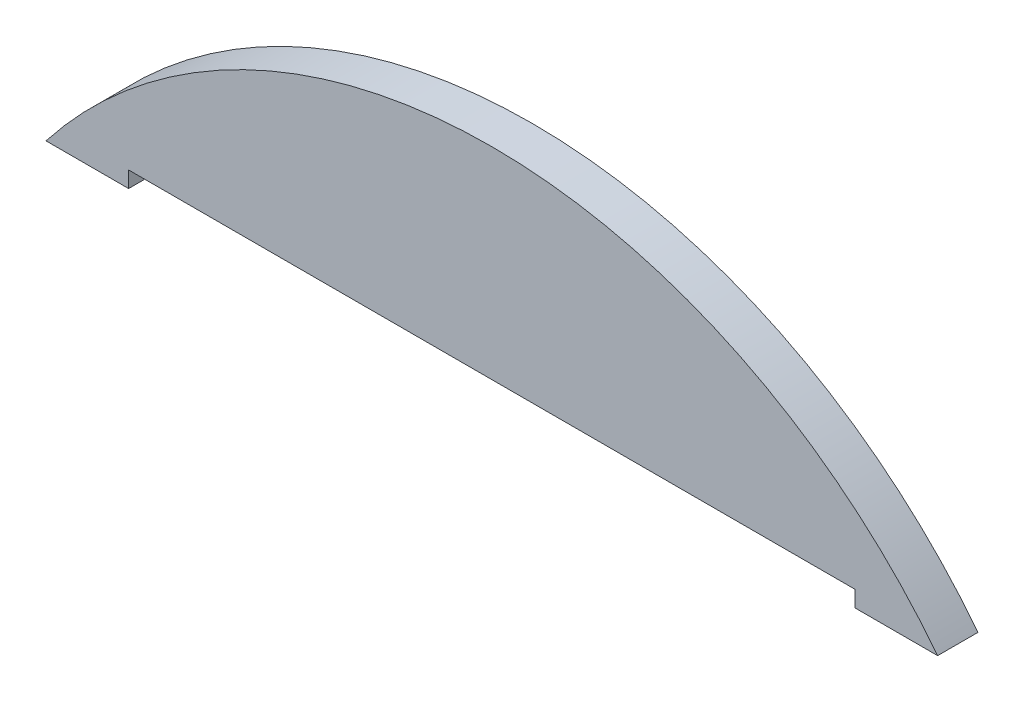
ISO-10303-21;
HEADER;
FILE_DESCRIPTION(('STEP AP214'),'2;1');
FILE_NAME('part.step','',(''),(''),'','','');
FILE_SCHEMA(('AUTOMOTIVE_DESIGN { 1 0 10303 214 1 1 1 1 }'));
ENDSEC;
DATA;
#1=APPLICATION_CONTEXT('core data for automotive mechanical design processes');
#2=APPLICATION_PROTOCOL_DEFINITION('international standard','automotive_design',2000,#1);
#3=PRODUCT_CONTEXT('',#1,'mechanical');
#4=PRODUCT('Part','Part','',(#3));
#5=PRODUCT_RELATED_PRODUCT_CATEGORY('part','',(#4));
#6=PRODUCT_DEFINITION_FORMATION('','',#4);
#7=PRODUCT_DEFINITION_CONTEXT('part definition',#1,'design');
#8=PRODUCT_DEFINITION('design','',#6,#7);
#9=PRODUCT_DEFINITION_SHAPE('','',#8);
#10=(LENGTH_UNIT() NAMED_UNIT(*) SI_UNIT(.MILLI.,.METRE.));
#11=(NAMED_UNIT(*) PLANE_ANGLE_UNIT() SI_UNIT($,.RADIAN.));
#12=(NAMED_UNIT(*) SI_UNIT($,.STERADIAN.) SOLID_ANGLE_UNIT());
#13=UNCERTAINTY_MEASURE_WITH_UNIT(LENGTH_MEASURE(1.E-05),#10,'distance_accuracy_value','');
#14=(GEOMETRIC_REPRESENTATION_CONTEXT(3) GLOBAL_UNCERTAINTY_ASSIGNED_CONTEXT((#13)) GLOBAL_UNIT_ASSIGNED_CONTEXT((#10,
#11,#12)) REPRESENTATION_CONTEXT('',''));
#15=CARTESIAN_POINT('',(0.,0.,0.));
#16=DIRECTION('',(0.,0.,1.));
#17=DIRECTION('',(1.,0.,0.));
#18=AXIS2_PLACEMENT_3D('',#15,#16,#17);
#19=CARTESIAN_POINT('',(0.,0.,5.));
#20=DIRECTION('',(0.,0.,1.));
#21=DIRECTION('',(1.,0.,0.));
#22=AXIS2_PLACEMENT_3D('',#19,#20,#21);
#23=PLANE('',#22);
#24=CARTESIAN_POINT('',(0.,0.,5.));
#25=DIRECTION('',(0.,0.,1.));
#26=DIRECTION('',(-1.,0.,0.));
#27=AXIS2_PLACEMENT_3D('',#24,#25,#26);
#28=CIRCLE('',#27,70.);
#29=CARTESIAN_POINT('',(55.2358579185659,43.,5.));
#30=VERTEX_POINT('',#29);
#31=CARTESIAN_POINT('',(-55.2358579185659,43.,5.));
#32=VERTEX_POINT('',#31);
#33=EDGE_CURVE('E93',#30,#32,#28,.T.);
#34=ORIENTED_EDGE('',*,*,#33,.T.);
#35=DIRECTION('',(1.,0.,0.));
#36=VECTOR('',#35,1.);
#37=CARTESIAN_POINT('',(-55.2358579185659,43.,5.));
#38=LINE('',#37,#36);
#39=CARTESIAN_POINT('',(-45.,43.,5.));
#40=VERTEX_POINT('',#39);
#41=EDGE_CURVE('E103',#32,#40,#38,.T.);
#42=ORIENTED_EDGE('',*,*,#41,.T.);
#43=DIRECTION('',(0.,-1.,0.));
#44=VECTOR('',#43,1.);
#45=CARTESIAN_POINT('',(-45.,-45.,5.));
#46=LINE('',#45,#44);
#47=CARTESIAN_POINT('',(-45.,45.,5.));
#48=VERTEX_POINT('',#47);
#49=EDGE_CURVE('E114',#48,#40,#46,.T.);
#50=ORIENTED_EDGE('',*,*,#49,.F.);
#51=DIRECTION('',(-1.,0.,0.));
#52=VECTOR('',#51,1.);
#53=CARTESIAN_POINT('',(-45.,45.,5.));
#54=LINE('',#53,#52);
#55=CARTESIAN_POINT('',(45.,45.,5.));
#56=VERTEX_POINT('',#55);
#57=EDGE_CURVE('E112',#56,#48,#54,.T.);
#58=ORIENTED_EDGE('',*,*,#57,.F.);
#59=DIRECTION('',(0.,1.,0.));
#60=VECTOR('',#59,1.);
#61=CARTESIAN_POINT('',(45.,45.,5.));
#62=LINE('',#61,#60);
#63=CARTESIAN_POINT('',(45.,43.,5.));
#64=VERTEX_POINT('',#63);
#65=EDGE_CURVE('E102',#64,#56,#62,.T.);
#66=ORIENTED_EDGE('',*,*,#65,.F.);
#67=EDGE_CURVE('E47',#64,#30,#38,.T.);
#68=ORIENTED_EDGE('',*,*,#67,.T.);
#69=EDGE_LOOP('',(#34,#42,#50,#58,#66,#68));
#70=FACE_BOUND('',#69,.T.);
#71=ADVANCED_FACE('F32',(#70),#23,.T.);
#72=CARTESIAN_POINT('',(0.,0.,0.));
#73=DIRECTION('',(0.,0.,1.));
#74=DIRECTION('',(1.,0.,0.));
#75=AXIS2_PLACEMENT_3D('',#72,#73,#74);
#76=PLANE('',#75);
#77=DIRECTION('',(1.,0.,0.));
#78=VECTOR('',#77,1.);
#79=CARTESIAN_POINT('',(0.,43.,0.));
#80=LINE('',#79,#78);
#81=CARTESIAN_POINT('',(-55.2358579185659,43.,0.));
#82=VERTEX_POINT('',#81);
#83=CARTESIAN_POINT('',(-45.,43.,0.));
#84=VERTEX_POINT('',#83);
#85=EDGE_CURVE('E109',#82,#84,#80,.T.);
#86=ORIENTED_EDGE('',*,*,#85,.F.);
#87=CARTESIAN_POINT('',(0.,0.,0.));
#88=DIRECTION('',(0.,0.,1.));
#89=DIRECTION('',(1.,0.,0.));
#90=AXIS2_PLACEMENT_3D('',#87,#88,#89);
#91=CIRCLE('',#90,70.);
#92=CARTESIAN_POINT('',(55.2358579185659,43.,0.));
#93=VERTEX_POINT('',#92);
#94=EDGE_CURVE('E11',#93,#82,#91,.T.);
#95=ORIENTED_EDGE('',*,*,#94,.F.);
#96=CARTESIAN_POINT('',(45.,43.,0.));
#97=VERTEX_POINT('',#96);
#98=EDGE_CURVE('E87',#97,#93,#80,.T.);
#99=ORIENTED_EDGE('',*,*,#98,.F.);
#100=DIRECTION('',(0.,1.,0.));
#101=VECTOR('',#100,1.);
#102=CARTESIAN_POINT('',(45.,45.,0.));
#103=LINE('',#102,#101);
#104=CARTESIAN_POINT('',(45.,45.,0.));
#105=VERTEX_POINT('',#104);
#106=EDGE_CURVE('E55',#97,#105,#103,.T.);
#107=ORIENTED_EDGE('',*,*,#106,.T.);
#108=DIRECTION('',(-1.,0.,0.));
#109=VECTOR('',#108,1.);
#110=CARTESIAN_POINT('',(-45.,45.,0.));
#111=LINE('',#110,#109);
#112=CARTESIAN_POINT('',(-45.,45.,0.));
#113=VERTEX_POINT('',#112);
#114=EDGE_CURVE('E119',#105,#113,#111,.T.);
#115=ORIENTED_EDGE('',*,*,#114,.T.);
#116=DIRECTION('',(0.,-1.,0.));
#117=VECTOR('',#116,1.);
#118=CARTESIAN_POINT('',(-45.,-45.,0.));
#119=LINE('',#118,#117);
#120=EDGE_CURVE('E121',#113,#84,#119,.T.);
#121=ORIENTED_EDGE('',*,*,#120,.T.);
#122=EDGE_LOOP('',(#86,#95,#99,#107,#115,#121));
#123=FACE_BOUND('',#122,.T.);
#124=ADVANCED_FACE('F34',(#123),#76,.F.);
#125=CARTESIAN_POINT('',(-45.,-45.,5.));
#126=DIRECTION('',(1.,0.,0.));
#127=DIRECTION('',(0.,1.,0.));
#128=AXIS2_PLACEMENT_3D('',#125,#126,#127);
#129=PLANE('',#128);
#130=ORIENTED_EDGE('',*,*,#49,.T.);
#131=DIRECTION('',(0.,0.,-1.));
#132=VECTOR('',#131,1.);
#133=CARTESIAN_POINT('',(-45.,43.,5.));
#134=LINE('',#133,#132);
#135=EDGE_CURVE('E108',#40,#84,#134,.T.);
#136=ORIENTED_EDGE('',*,*,#135,.T.);
#137=ORIENTED_EDGE('',*,*,#120,.F.);
#138=DIRECTION('',(0.,0.,-1.));
#139=VECTOR('',#138,1.);
#140=CARTESIAN_POINT('',(-45.,45.,5.));
#141=LINE('',#140,#139);
#142=EDGE_CURVE('E127',#48,#113,#141,.T.);
#143=ORIENTED_EDGE('',*,*,#142,.F.);
#144=EDGE_LOOP('',(#130,#136,#137,#143));
#145=FACE_BOUND('',#144,.T.);
#146=ADVANCED_FACE('F138',(#145),#129,.T.);
#147=CARTESIAN_POINT('',(45.,45.,5.));
#148=DIRECTION('',(-1.,0.,0.));
#149=DIRECTION('',(0.,-1.,0.));
#150=AXIS2_PLACEMENT_3D('',#147,#148,#149);
#151=PLANE('',#150);
#152=ORIENTED_EDGE('',*,*,#106,.F.);
#153=DIRECTION('',(0.,0.,1.));
#154=VECTOR('',#153,1.);
#155=CARTESIAN_POINT('',(45.,43.,5.));
#156=LINE('',#155,#154);
#157=EDGE_CURVE('E40',#97,#64,#156,.T.);
#158=ORIENTED_EDGE('',*,*,#157,.T.);
#159=ORIENTED_EDGE('',*,*,#65,.T.);
#160=DIRECTION('',(0.,0.,-1.));
#161=VECTOR('',#160,1.);
#162=CARTESIAN_POINT('',(45.,45.,5.));
#163=LINE('',#162,#161);
#164=EDGE_CURVE('E118',#56,#105,#163,.T.);
#165=ORIENTED_EDGE('',*,*,#164,.T.);
#166=EDGE_LOOP('',(#152,#158,#159,#165));
#167=FACE_BOUND('',#166,.T.);
#168=ADVANCED_FACE('F130',(#167),#151,.T.);
#169=CARTESIAN_POINT('',(-45.,45.,5.));
#170=DIRECTION('',(0.,-1.,0.));
#171=DIRECTION('',(0.,0.,-1.));
#172=AXIS2_PLACEMENT_3D('',#169,#170,#171);
#173=PLANE('',#172);
#174=ORIENTED_EDGE('',*,*,#114,.F.);
#175=ORIENTED_EDGE('',*,*,#164,.F.);
#176=ORIENTED_EDGE('',*,*,#57,.T.);
#177=ORIENTED_EDGE('',*,*,#142,.T.);
#178=EDGE_LOOP('',(#174,#175,#176,#177));
#179=FACE_BOUND('',#178,.T.);
#180=ADVANCED_FACE('F140',(#179),#173,.T.);
#181=CARTESIAN_POINT('',(0.,0.,-5.));
#182=DIRECTION('',(0.,0.,1.));
#183=DIRECTION('',(1.,0.,0.));
#184=AXIS2_PLACEMENT_3D('',#181,#182,#183);
#185=CYLINDRICAL_SURFACE('',#184,70.);
#186=ORIENTED_EDGE('',*,*,#94,.T.);
#187=DIRECTION('',(0.,0.,1.));
#188=VECTOR('',#187,1.);
#189=CARTESIAN_POINT('',(-55.2358579185659,43.,-5.));
#190=LINE('',#189,#188);
#191=EDGE_CURVE('E90',#82,#32,#190,.T.);
#192=ORIENTED_EDGE('',*,*,#191,.T.);
#193=ORIENTED_EDGE('',*,*,#33,.F.);
#194=DIRECTION('',(0.,0.,1.));
#195=VECTOR('',#194,1.);
#196=CARTESIAN_POINT('',(55.2358579185659,43.,-5.));
#197=LINE('',#196,#195);
#198=EDGE_CURVE('E84',#93,#30,#197,.T.);
#199=ORIENTED_EDGE('',*,*,#198,.F.);
#200=EDGE_LOOP('',(#186,#192,#193,#199));
#201=FACE_BOUND('',#200,.T.);
#202=ADVANCED_FACE('F94',(#201),#185,.T.);
#203=CARTESIAN_POINT('',(-55.2358579185659,43.,-5.));
#204=DIRECTION('',(0.,-1.,0.));
#205=DIRECTION('',(0.,0.,-1.));
#206=AXIS2_PLACEMENT_3D('',#203,#204,#205);
#207=PLANE('',#206);
#208=ORIENTED_EDGE('',*,*,#85,.T.);
#209=ORIENTED_EDGE('',*,*,#135,.F.);
#210=ORIENTED_EDGE('',*,*,#41,.F.);
#211=ORIENTED_EDGE('',*,*,#191,.F.);
#212=EDGE_LOOP('',(#208,#209,#210,#211));
#213=FACE_BOUND('',#212,.T.);
#214=ADVANCED_FACE('F134',(#213),#207,.T.);
#215=ORIENTED_EDGE('',*,*,#98,.T.);
#216=ORIENTED_EDGE('',*,*,#198,.T.);
#217=ORIENTED_EDGE('',*,*,#67,.F.);
#218=ORIENTED_EDGE('',*,*,#157,.F.);
#219=EDGE_LOOP('',(#215,#216,#217,#218));
#220=FACE_BOUND('',#219,.T.);
#221=ADVANCED_FACE('F86',(#220),#207,.T.);
#222=CLOSED_SHELL('',(#71,#124,#146,#168,#180,#202,#214,#221));
#223=MANIFOLD_SOLID_BREP('B2',#222);
#224=ADVANCED_BREP_SHAPE_REPRESENTATION('',(#18,#223),#14);
#225=SHAPE_DEFINITION_REPRESENTATION(#9,#224);
ENDSEC;
END-ISO-10303-21;
